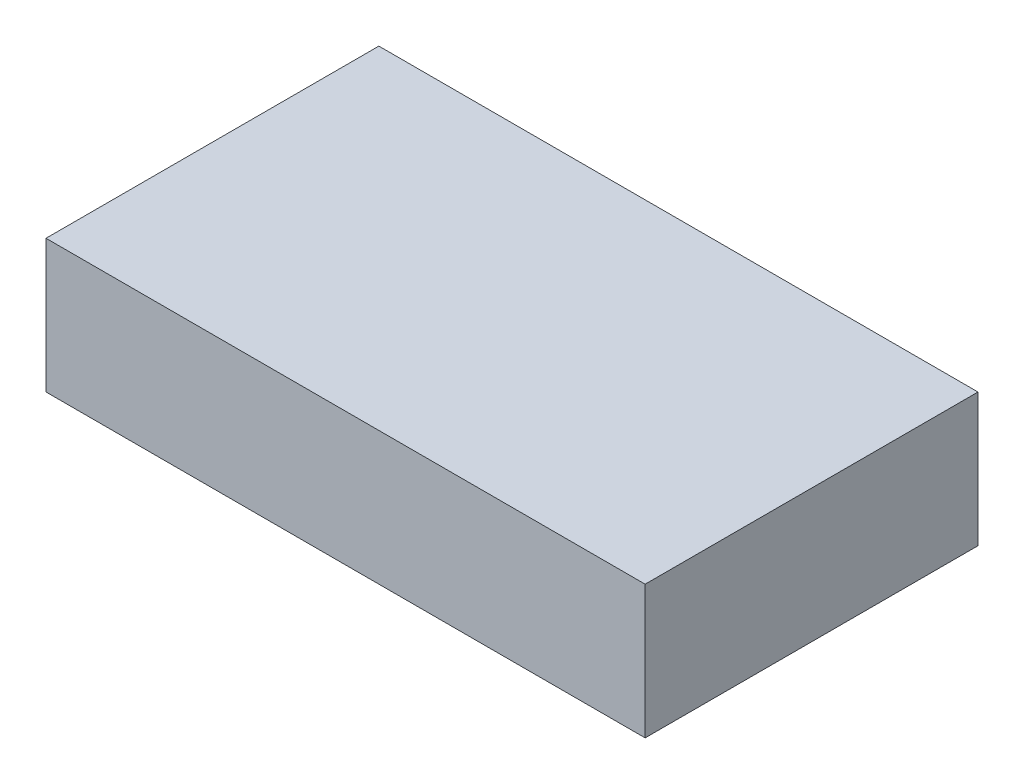
ISO-10303-21;
HEADER;
FILE_DESCRIPTION(('STEP AP214'),'2;1');
FILE_NAME('part.step','',(''),(''),'','','');
FILE_SCHEMA(('AUTOMOTIVE_DESIGN { 1 0 10303 214 1 1 1 1 }'));
ENDSEC;
DATA;
#1=APPLICATION_CONTEXT('core data for automotive mechanical design processes');
#2=APPLICATION_PROTOCOL_DEFINITION('international standard','automotive_design',2000,#1);
#3=PRODUCT_CONTEXT('',#1,'mechanical');
#4=PRODUCT('Part','Part','',(#3));
#5=PRODUCT_RELATED_PRODUCT_CATEGORY('part','',(#4));
#6=PRODUCT_DEFINITION_FORMATION('','',#4);
#7=PRODUCT_DEFINITION_CONTEXT('part definition',#1,'design');
#8=PRODUCT_DEFINITION('design','',#6,#7);
#9=PRODUCT_DEFINITION_SHAPE('','',#8);
#10=(LENGTH_UNIT() NAMED_UNIT(*) SI_UNIT(.MILLI.,.METRE.));
#11=(NAMED_UNIT(*) PLANE_ANGLE_UNIT() SI_UNIT($,.RADIAN.));
#12=(NAMED_UNIT(*) SI_UNIT($,.STERADIAN.) SOLID_ANGLE_UNIT());
#13=UNCERTAINTY_MEASURE_WITH_UNIT(LENGTH_MEASURE(1.E-05),#10,'distance_accuracy_value','');
#14=(GEOMETRIC_REPRESENTATION_CONTEXT(3) GLOBAL_UNCERTAINTY_ASSIGNED_CONTEXT((#13)) GLOBAL_UNIT_ASSIGNED_CONTEXT((#10,
#11,#12)) REPRESENTATION_CONTEXT('',''));
#15=CARTESIAN_POINT('',(0.,0.,0.));
#16=DIRECTION('',(0.,0.,1.));
#17=DIRECTION('',(1.,0.,0.));
#18=AXIS2_PLACEMENT_3D('',#15,#16,#17);
#19=CARTESIAN_POINT('',(22.5,10.,-12.5));
#20=DIRECTION('',(-1.,0.,0.));
#21=DIRECTION('',(0.,0.,1.));
#22=AXIS2_PLACEMENT_3D('',#19,#20,#21);
#23=PLANE('',#22);
#24=DIRECTION('',(0.,0.,-1.));
#25=VECTOR('',#24,1.);
#26=CARTESIAN_POINT('',(22.5,0.,-12.5));
#27=LINE('',#26,#25);
#28=CARTESIAN_POINT('',(22.5,0.,12.5));
#29=VERTEX_POINT('',#28);
#30=CARTESIAN_POINT('',(22.5,0.,-12.5));
#31=VERTEX_POINT('',#30);
#32=EDGE_CURVE('E106',#29,#31,#27,.T.);
#33=ORIENTED_EDGE('',*,*,#32,.T.);
#34=DIRECTION('',(0.,-1.,0.));
#35=VECTOR('',#34,1.);
#36=CARTESIAN_POINT('',(22.5,10.,-12.5));
#37=LINE('',#36,#35);
#38=CARTESIAN_POINT('',(22.5,10.,-12.5));
#39=VERTEX_POINT('',#38);
#40=EDGE_CURVE('E11',#39,#31,#37,.T.);
#41=ORIENTED_EDGE('',*,*,#40,.F.);
#42=DIRECTION('',(0.,0.,-1.));
#43=VECTOR('',#42,1.);
#44=CARTESIAN_POINT('',(22.5,10.,-12.5));
#45=LINE('',#44,#43);
#46=CARTESIAN_POINT('',(22.5,10.,12.5));
#47=VERTEX_POINT('',#46);
#48=EDGE_CURVE('E94',#47,#39,#45,.T.);
#49=ORIENTED_EDGE('',*,*,#48,.F.);
#50=DIRECTION('',(0.,-1.,0.));
#51=VECTOR('',#50,1.);
#52=CARTESIAN_POINT('',(22.5,10.,12.5));
#53=LINE('',#52,#51);
#54=EDGE_CURVE('E102',#47,#29,#53,.T.);
#55=ORIENTED_EDGE('',*,*,#54,.T.);
#56=EDGE_LOOP('',(#33,#41,#49,#55));
#57=FACE_BOUND('',#56,.T.);
#58=ADVANCED_FACE('F43',(#57),#23,.F.);
#59=CARTESIAN_POINT('',(-22.5,10.,-12.5));
#60=DIRECTION('',(0.,0.,1.));
#61=DIRECTION('',(1.,0.,0.));
#62=AXIS2_PLACEMENT_3D('',#59,#60,#61);
#63=PLANE('',#62);
#64=DIRECTION('',(-1.,0.,0.));
#65=VECTOR('',#64,1.);
#66=CARTESIAN_POINT('',(-22.5,0.,-12.5));
#67=LINE('',#66,#65);
#68=CARTESIAN_POINT('',(-22.5,0.,-12.5));
#69=VERTEX_POINT('',#68);
#70=EDGE_CURVE('E98',#31,#69,#67,.T.);
#71=ORIENTED_EDGE('',*,*,#70,.T.);
#72=DIRECTION('',(0.,-1.,0.));
#73=VECTOR('',#72,1.);
#74=CARTESIAN_POINT('',(-22.5,10.,-12.5));
#75=LINE('',#74,#73);
#76=CARTESIAN_POINT('',(-22.5,10.,-12.5));
#77=VERTEX_POINT('',#76);
#78=EDGE_CURVE('E51',#77,#69,#75,.T.);
#79=ORIENTED_EDGE('',*,*,#78,.F.);
#80=DIRECTION('',(-1.,0.,0.));
#81=VECTOR('',#80,1.);
#82=CARTESIAN_POINT('',(-22.5,10.,-12.5));
#83=LINE('',#82,#81);
#84=EDGE_CURVE('E89',#39,#77,#83,.T.);
#85=ORIENTED_EDGE('',*,*,#84,.F.);
#86=ORIENTED_EDGE('',*,*,#40,.T.);
#87=EDGE_LOOP('',(#71,#79,#85,#86));
#88=FACE_BOUND('',#87,.T.);
#89=ADVANCED_FACE('F97',(#88),#63,.F.);
#90=CARTESIAN_POINT('',(-22.5,10.,-12.5));
#91=DIRECTION('',(1.,0.,0.));
#92=DIRECTION('',(0.,0.,-1.));
#93=AXIS2_PLACEMENT_3D('',#90,#91,#92);
#94=PLANE('',#93);
#95=DIRECTION('',(0.,0.,1.));
#96=VECTOR('',#95,1.);
#97=CARTESIAN_POINT('',(-22.5,0.,-12.5));
#98=LINE('',#97,#96);
#99=CARTESIAN_POINT('',(-22.5,0.,12.5));
#100=VERTEX_POINT('',#99);
#101=EDGE_CURVE('E76',#69,#100,#98,.T.);
#102=ORIENTED_EDGE('',*,*,#101,.T.);
#103=DIRECTION('',(0.,-1.,0.));
#104=VECTOR('',#103,1.);
#105=CARTESIAN_POINT('',(-22.5,10.,12.5));
#106=LINE('',#105,#104);
#107=CARTESIAN_POINT('',(-22.5,10.,12.5));
#108=VERTEX_POINT('',#107);
#109=EDGE_CURVE('E99',#108,#100,#106,.T.);
#110=ORIENTED_EDGE('',*,*,#109,.F.);
#111=DIRECTION('',(0.,0.,1.));
#112=VECTOR('',#111,1.);
#113=CARTESIAN_POINT('',(-22.5,10.,-12.5));
#114=LINE('',#113,#112);
#115=EDGE_CURVE('E92',#77,#108,#114,.T.);
#116=ORIENTED_EDGE('',*,*,#115,.F.);
#117=ORIENTED_EDGE('',*,*,#78,.T.);
#118=EDGE_LOOP('',(#102,#110,#116,#117));
#119=FACE_BOUND('',#118,.T.);
#120=ADVANCED_FACE('F100',(#119),#94,.F.);
#121=CARTESIAN_POINT('',(-22.5,10.,12.5));
#122=DIRECTION('',(0.,0.,-1.));
#123=DIRECTION('',(-1.,0.,0.));
#124=AXIS2_PLACEMENT_3D('',#121,#122,#123);
#125=PLANE('',#124);
#126=DIRECTION('',(1.,0.,0.));
#127=VECTOR('',#126,1.);
#128=CARTESIAN_POINT('',(-22.5,0.,12.5));
#129=LINE('',#128,#127);
#130=EDGE_CURVE('E82',#100,#29,#129,.T.);
#131=ORIENTED_EDGE('',*,*,#130,.T.);
#132=ORIENTED_EDGE('',*,*,#54,.F.);
#133=DIRECTION('',(1.,0.,0.));
#134=VECTOR('',#133,1.);
#135=CARTESIAN_POINT('',(-22.5,10.,12.5));
#136=LINE('',#135,#134);
#137=EDGE_CURVE('E59',#108,#47,#136,.T.);
#138=ORIENTED_EDGE('',*,*,#137,.F.);
#139=ORIENTED_EDGE('',*,*,#109,.T.);
#140=EDGE_LOOP('',(#131,#132,#138,#139));
#141=FACE_BOUND('',#140,.T.);
#142=ADVANCED_FACE('F113',(#141),#125,.F.);
#143=CARTESIAN_POINT('',(0.,10.,0.));
#144=DIRECTION('',(0.,1.,0.));
#145=DIRECTION('',(0.,0.,1.));
#146=AXIS2_PLACEMENT_3D('',#143,#144,#145);
#147=PLANE('',#146);
#148=ORIENTED_EDGE('',*,*,#48,.T.);
#149=ORIENTED_EDGE('',*,*,#84,.T.);
#150=ORIENTED_EDGE('',*,*,#115,.T.);
#151=ORIENTED_EDGE('',*,*,#137,.T.);
#152=EDGE_LOOP('',(#148,#149,#150,#151));
#153=FACE_BOUND('',#152,.T.);
#154=ADVANCED_FACE('F90',(#153),#147,.T.);
#155=CARTESIAN_POINT('',(0.,0.,0.));
#156=DIRECTION('',(0.,1.,0.));
#157=DIRECTION('',(0.,0.,1.));
#158=AXIS2_PLACEMENT_3D('',#155,#156,#157);
#159=PLANE('',#158);
#160=ORIENTED_EDGE('',*,*,#32,.F.);
#161=ORIENTED_EDGE('',*,*,#130,.F.);
#162=ORIENTED_EDGE('',*,*,#101,.F.);
#163=ORIENTED_EDGE('',*,*,#70,.F.);
#164=EDGE_LOOP('',(#160,#161,#162,#163));
#165=FACE_BOUND('',#164,.T.);
#166=ADVANCED_FACE('F116',(#165),#159,.F.);
#167=CLOSED_SHELL('',(#58,#89,#120,#142,#154,#166));
#168=MANIFOLD_SOLID_BREP('B2',#167);
#169=ADVANCED_BREP_SHAPE_REPRESENTATION('',(#18,#168),#14);
#170=SHAPE_DEFINITION_REPRESENTATION(#9,#169);
ENDSEC;
END-ISO-10303-21;
